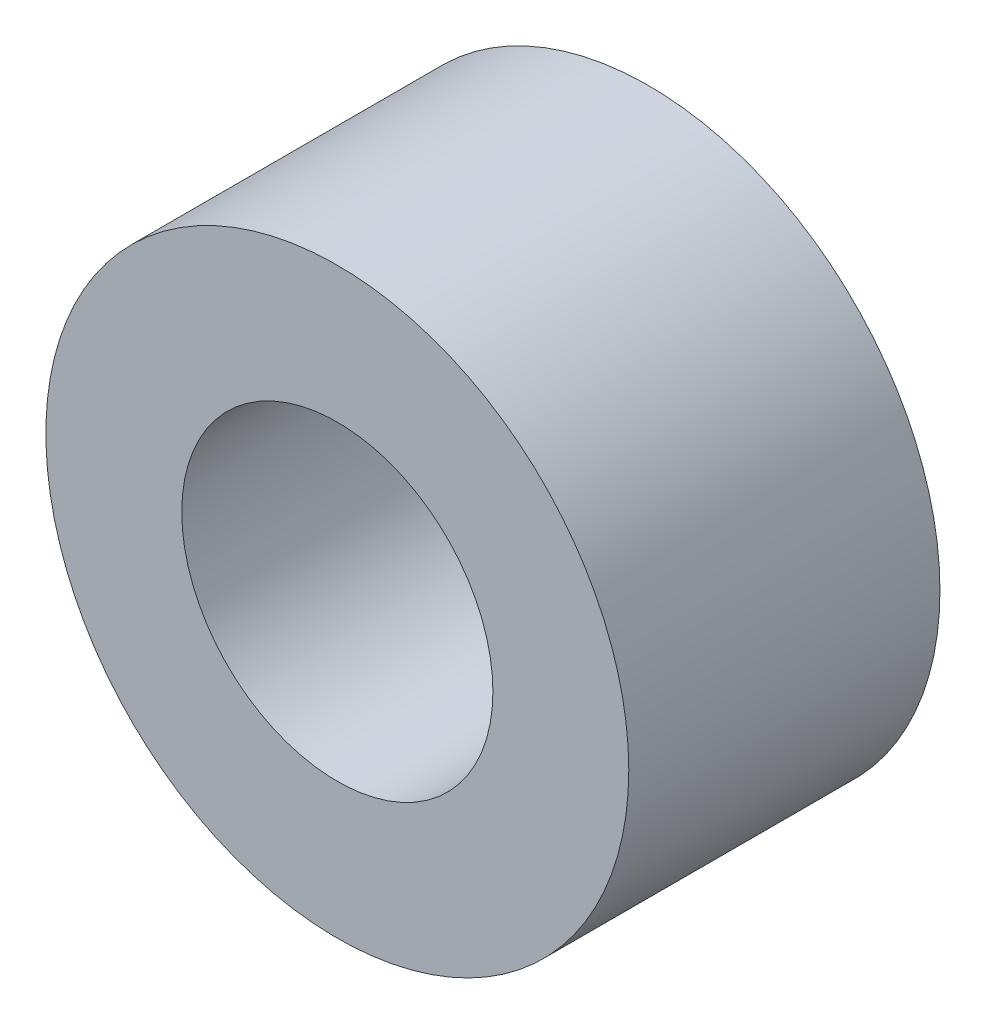
ISO-10303-21;
HEADER;
FILE_DESCRIPTION(('STEP AP214'),'2;1');
FILE_NAME('part.step','',(''),(''),'','','');
FILE_SCHEMA(('AUTOMOTIVE_DESIGN { 1 0 10303 214 1 1 1 1 }'));
ENDSEC;
DATA;
#1=APPLICATION_CONTEXT('core data for automotive mechanical design processes');
#2=APPLICATION_PROTOCOL_DEFINITION('international standard','automotive_design',2000,#1);
#3=PRODUCT_CONTEXT('',#1,'mechanical');
#4=PRODUCT('Part','Part','',(#3));
#5=PRODUCT_RELATED_PRODUCT_CATEGORY('part','',(#4));
#6=PRODUCT_DEFINITION_FORMATION('','',#4);
#7=PRODUCT_DEFINITION_CONTEXT('part definition',#1,'design');
#8=PRODUCT_DEFINITION('design','',#6,#7);
#9=PRODUCT_DEFINITION_SHAPE('','',#8);
#10=(LENGTH_UNIT() NAMED_UNIT(*) SI_UNIT(.MILLI.,.METRE.));
#11=(NAMED_UNIT(*) PLANE_ANGLE_UNIT() SI_UNIT($,.RADIAN.));
#12=(NAMED_UNIT(*) SI_UNIT($,.STERADIAN.) SOLID_ANGLE_UNIT());
#13=UNCERTAINTY_MEASURE_WITH_UNIT(LENGTH_MEASURE(1.E-05),#10,'distance_accuracy_value','');
#14=(GEOMETRIC_REPRESENTATION_CONTEXT(3) GLOBAL_UNCERTAINTY_ASSIGNED_CONTEXT((#13)) GLOBAL_UNIT_ASSIGNED_CONTEXT((#10,
#11,#12)) REPRESENTATION_CONTEXT('',''));
#15=CARTESIAN_POINT('',(0.,0.,0.));
#16=DIRECTION('',(0.,0.,1.));
#17=DIRECTION('',(1.,0.,0.));
#18=AXIS2_PLACEMENT_3D('',#15,#16,#17);
#19=CARTESIAN_POINT('',(0.,0.,15.));
#20=DIRECTION('',(0.,0.,1.));
#21=DIRECTION('',(1.,0.,0.));
#22=AXIS2_PLACEMENT_3D('',#19,#20,#21);
#23=PLANE('',#22);
#24=CARTESIAN_POINT('',(0.,0.,15.));
#25=DIRECTION('',(0.,0.,1.));
#26=DIRECTION('',(1.,0.,0.));
#27=AXIS2_PLACEMENT_3D('',#24,#25,#26);
#28=CIRCLE('',#27,14.05);
#29=CARTESIAN_POINT('',(14.05,0.,15.));
#30=VERTEX_POINT('',#29);
#31=EDGE_CURVE('E10',#30,#30,#28,.T.);
#32=ORIENTED_EDGE('',*,*,#31,.T.);
#33=EDGE_LOOP('',(#32));
#34=FACE_BOUND('',#33,.T.);
#35=CARTESIAN_POINT('',(0.,0.,15.));
#36=DIRECTION('',(0.,0.,1.));
#37=DIRECTION('',(1.,0.,0.));
#38=AXIS2_PLACEMENT_3D('',#35,#36,#37);
#39=CIRCLE('',#38,7.5);
#40=CARTESIAN_POINT('',(7.5,0.,15.));
#41=VERTEX_POINT('',#40);
#42=EDGE_CURVE('E48',#41,#41,#39,.T.);
#43=ORIENTED_EDGE('',*,*,#42,.F.);
#44=EDGE_LOOP('',(#43));
#45=FACE_BOUND('',#44,.T.);
#46=ADVANCED_FACE('F37',(#34,#45),#23,.T.);
#47=CARTESIAN_POINT('',(0.,0.,0.));
#48=DIRECTION('',(0.,0.,1.));
#49=DIRECTION('',(1.,0.,0.));
#50=AXIS2_PLACEMENT_3D('',#47,#48,#49);
#51=PLANE('',#50);
#52=CARTESIAN_POINT('',(0.,0.,0.));
#53=DIRECTION('',(0.,0.,1.));
#54=DIRECTION('',(1.,0.,0.));
#55=AXIS2_PLACEMENT_3D('',#52,#53,#54);
#56=CIRCLE('',#55,14.05);
#57=CARTESIAN_POINT('',(14.05,0.,0.));
#58=VERTEX_POINT('',#57);
#59=EDGE_CURVE('E41',#58,#58,#56,.T.);
#60=ORIENTED_EDGE('',*,*,#59,.F.);
#61=EDGE_LOOP('',(#60));
#62=FACE_BOUND('',#61,.T.);
#63=CARTESIAN_POINT('',(0.,0.,0.));
#64=DIRECTION('',(0.,0.,1.));
#65=DIRECTION('',(1.,0.,0.));
#66=AXIS2_PLACEMENT_3D('',#63,#64,#65);
#67=CIRCLE('',#66,7.5);
#68=CARTESIAN_POINT('',(7.5,0.,0.));
#69=VERTEX_POINT('',#68);
#70=EDGE_CURVE('E50',#69,#69,#67,.T.);
#71=ORIENTED_EDGE('',*,*,#70,.T.);
#72=EDGE_LOOP('',(#71));
#73=FACE_BOUND('',#72,.T.);
#74=ADVANCED_FACE('F60',(#62,#73),#51,.F.);
#75=CARTESIAN_POINT('',(0.,0.,15.));
#76=DIRECTION('',(0.,0.,-1.));
#77=DIRECTION('',(-1.,0.,0.));
#78=AXIS2_PLACEMENT_3D('',#75,#76,#77);
#79=CYLINDRICAL_SURFACE('',#78,14.05);
#80=ORIENTED_EDGE('',*,*,#31,.F.);
#81=EDGE_LOOP('',(#80));
#82=FACE_BOUND('',#81,.T.);
#83=ORIENTED_EDGE('',*,*,#59,.T.);
#84=EDGE_LOOP('',(#83));
#85=FACE_BOUND('',#84,.T.);
#86=ADVANCED_FACE('F39',(#82,#85),#79,.T.);
#87=CARTESIAN_POINT('',(0.,0.,15.));
#88=DIRECTION('',(0.,0.,-1.));
#89=DIRECTION('',(-1.,0.,0.));
#90=AXIS2_PLACEMENT_3D('',#87,#88,#89);
#91=CYLINDRICAL_SURFACE('',#90,7.5);
#92=ORIENTED_EDGE('',*,*,#42,.T.);
#93=EDGE_LOOP('',(#92));
#94=FACE_BOUND('',#93,.T.);
#95=ORIENTED_EDGE('',*,*,#70,.F.);
#96=EDGE_LOOP('',(#95));
#97=FACE_BOUND('',#96,.T.);
#98=ADVANCED_FACE('F56',(#94,#97),#91,.F.);
#99=CLOSED_SHELL('',(#46,#74,#86,#98));
#100=MANIFOLD_SOLID_BREP('B2',#99);
#101=ADVANCED_BREP_SHAPE_REPRESENTATION('',(#18,#100),#14);
#102=SHAPE_DEFINITION_REPRESENTATION(#9,#101);
ENDSEC;
END-ISO-10303-21;
